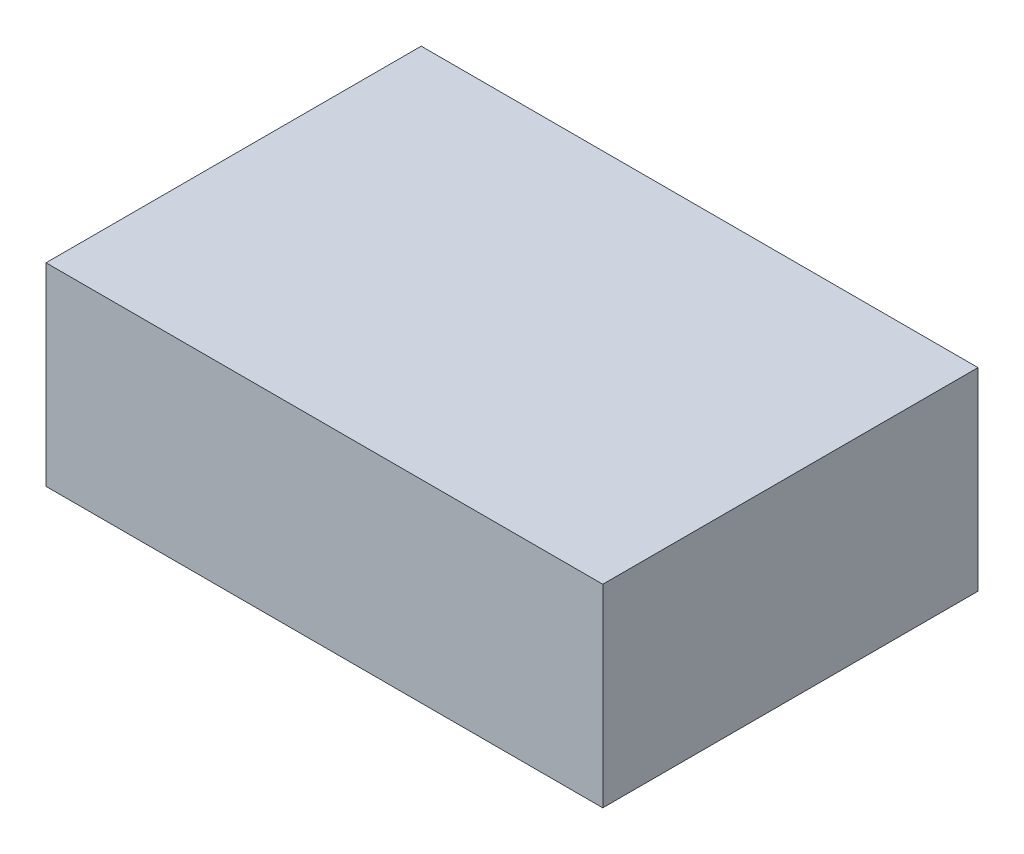
ISO-10303-21;
HEADER;
FILE_DESCRIPTION(('STEP AP214'),'2;1');
FILE_NAME('part.step','',(''),(''),'','','');
FILE_SCHEMA(('AUTOMOTIVE_DESIGN { 1 0 10303 214 1 1 1 1 }'));
ENDSEC;
DATA;
#1=APPLICATION_CONTEXT('core data for automotive mechanical design processes');
#2=APPLICATION_PROTOCOL_DEFINITION('international standard','automotive_design',2000,#1);
#3=PRODUCT_CONTEXT('',#1,'mechanical');
#4=PRODUCT('Part','Part','',(#3));
#5=PRODUCT_RELATED_PRODUCT_CATEGORY('part','',(#4));
#6=PRODUCT_DEFINITION_FORMATION('','',#4);
#7=PRODUCT_DEFINITION_CONTEXT('part definition',#1,'design');
#8=PRODUCT_DEFINITION('design','',#6,#7);
#9=PRODUCT_DEFINITION_SHAPE('','',#8);
#10=(LENGTH_UNIT() NAMED_UNIT(*) SI_UNIT(.MILLI.,.METRE.));
#11=(NAMED_UNIT(*) PLANE_ANGLE_UNIT() SI_UNIT($,.RADIAN.));
#12=(NAMED_UNIT(*) SI_UNIT($,.STERADIAN.) SOLID_ANGLE_UNIT());
#13=UNCERTAINTY_MEASURE_WITH_UNIT(LENGTH_MEASURE(1.E-05),#10,'distance_accuracy_value','');
#14=(GEOMETRIC_REPRESENTATION_CONTEXT(3) GLOBAL_UNCERTAINTY_ASSIGNED_CONTEXT((#13)) GLOBAL_UNIT_ASSIGNED_CONTEXT((#10,
#11,#12)) REPRESENTATION_CONTEXT('',''));
#15=CARTESIAN_POINT('',(0.,0.,0.));
#16=DIRECTION('',(0.,0.,1.));
#17=DIRECTION('',(1.,0.,0.));
#18=AXIS2_PLACEMENT_3D('',#15,#16,#17);
#19=CARTESIAN_POINT('',(23.,16.,-15.5));
#20=DIRECTION('',(-1.,0.,0.));
#21=DIRECTION('',(0.,0.,1.));
#22=AXIS2_PLACEMENT_3D('',#19,#20,#21);
#23=PLANE('',#22);
#24=DIRECTION('',(0.,0.,-1.));
#25=VECTOR('',#24,1.);
#26=CARTESIAN_POINT('',(23.,0.,-15.5));
#27=LINE('',#26,#25);
#28=CARTESIAN_POINT('',(23.,0.,15.5));
#29=VERTEX_POINT('',#28);
#30=CARTESIAN_POINT('',(23.,0.,-15.5));
#31=VERTEX_POINT('',#30);
#32=EDGE_CURVE('E96',#29,#31,#27,.T.);
#33=ORIENTED_EDGE('',*,*,#32,.T.);
#34=DIRECTION('',(0.,-1.,0.));
#35=VECTOR('',#34,1.);
#36=CARTESIAN_POINT('',(23.,16.,-15.5));
#37=LINE('',#36,#35);
#38=CARTESIAN_POINT('',(23.,16.,-15.5));
#39=VERTEX_POINT('',#38);
#40=EDGE_CURVE('E11',#39,#31,#37,.T.);
#41=ORIENTED_EDGE('',*,*,#40,.F.);
#42=DIRECTION('',(0.,0.,-1.));
#43=VECTOR('',#42,1.);
#44=CARTESIAN_POINT('',(23.,16.,-15.5));
#45=LINE('',#44,#43);
#46=CARTESIAN_POINT('',(23.,16.,15.5));
#47=VERTEX_POINT('',#46);
#48=EDGE_CURVE('E84',#47,#39,#45,.T.);
#49=ORIENTED_EDGE('',*,*,#48,.F.);
#50=DIRECTION('',(0.,-1.,0.));
#51=VECTOR('',#50,1.);
#52=CARTESIAN_POINT('',(23.,16.,15.5));
#53=LINE('',#52,#51);
#54=EDGE_CURVE('E92',#47,#29,#53,.T.);
#55=ORIENTED_EDGE('',*,*,#54,.T.);
#56=EDGE_LOOP('',(#33,#41,#49,#55));
#57=FACE_BOUND('',#56,.T.);
#58=ADVANCED_FACE('F33',(#57),#23,.F.);
#59=CARTESIAN_POINT('',(-23.,16.,-15.5));
#60=DIRECTION('',(0.,0.,1.));
#61=DIRECTION('',(1.,0.,0.));
#62=AXIS2_PLACEMENT_3D('',#59,#60,#61);
#63=PLANE('',#62);
#64=DIRECTION('',(-1.,0.,0.));
#65=VECTOR('',#64,1.);
#66=CARTESIAN_POINT('',(-23.,0.,-15.5));
#67=LINE('',#66,#65);
#68=CARTESIAN_POINT('',(-23.,0.,-15.5));
#69=VERTEX_POINT('',#68);
#70=EDGE_CURVE('E88',#31,#69,#67,.T.);
#71=ORIENTED_EDGE('',*,*,#70,.T.);
#72=DIRECTION('',(0.,-1.,0.));
#73=VECTOR('',#72,1.);
#74=CARTESIAN_POINT('',(-23.,16.,-15.5));
#75=LINE('',#74,#73);
#76=CARTESIAN_POINT('',(-23.,16.,-15.5));
#77=VERTEX_POINT('',#76);
#78=EDGE_CURVE('E41',#77,#69,#75,.T.);
#79=ORIENTED_EDGE('',*,*,#78,.F.);
#80=DIRECTION('',(-1.,0.,0.));
#81=VECTOR('',#80,1.);
#82=CARTESIAN_POINT('',(-23.,16.,-15.5));
#83=LINE('',#82,#81);
#84=EDGE_CURVE('E79',#39,#77,#83,.T.);
#85=ORIENTED_EDGE('',*,*,#84,.F.);
#86=ORIENTED_EDGE('',*,*,#40,.T.);
#87=EDGE_LOOP('',(#71,#79,#85,#86));
#88=FACE_BOUND('',#87,.T.);
#89=ADVANCED_FACE('F87',(#88),#63,.F.);
#90=CARTESIAN_POINT('',(-23.,16.,-15.5));
#91=DIRECTION('',(1.,0.,0.));
#92=DIRECTION('',(0.,0.,-1.));
#93=AXIS2_PLACEMENT_3D('',#90,#91,#92);
#94=PLANE('',#93);
#95=DIRECTION('',(0.,0.,1.));
#96=VECTOR('',#95,1.);
#97=CARTESIAN_POINT('',(-23.,0.,-15.5));
#98=LINE('',#97,#96);
#99=CARTESIAN_POINT('',(-23.,0.,15.5));
#100=VERTEX_POINT('',#99);
#101=EDGE_CURVE('E66',#69,#100,#98,.T.);
#102=ORIENTED_EDGE('',*,*,#101,.T.);
#103=DIRECTION('',(0.,-1.,0.));
#104=VECTOR('',#103,1.);
#105=CARTESIAN_POINT('',(-23.,16.,15.5));
#106=LINE('',#105,#104);
#107=CARTESIAN_POINT('',(-23.,16.,15.5));
#108=VERTEX_POINT('',#107);
#109=EDGE_CURVE('E89',#108,#100,#106,.T.);
#110=ORIENTED_EDGE('',*,*,#109,.F.);
#111=DIRECTION('',(0.,0.,1.));
#112=VECTOR('',#111,1.);
#113=CARTESIAN_POINT('',(-23.,16.,-15.5));
#114=LINE('',#113,#112);
#115=EDGE_CURVE('E82',#77,#108,#114,.T.);
#116=ORIENTED_EDGE('',*,*,#115,.F.);
#117=ORIENTED_EDGE('',*,*,#78,.T.);
#118=EDGE_LOOP('',(#102,#110,#116,#117));
#119=FACE_BOUND('',#118,.T.);
#120=ADVANCED_FACE('F90',(#119),#94,.F.);
#121=CARTESIAN_POINT('',(-23.,16.,15.5));
#122=DIRECTION('',(0.,0.,-1.));
#123=DIRECTION('',(-1.,0.,0.));
#124=AXIS2_PLACEMENT_3D('',#121,#122,#123);
#125=PLANE('',#124);
#126=DIRECTION('',(1.,0.,0.));
#127=VECTOR('',#126,1.);
#128=CARTESIAN_POINT('',(-23.,0.,15.5));
#129=LINE('',#128,#127);
#130=EDGE_CURVE('E72',#100,#29,#129,.T.);
#131=ORIENTED_EDGE('',*,*,#130,.T.);
#132=ORIENTED_EDGE('',*,*,#54,.F.);
#133=DIRECTION('',(1.,0.,0.));
#134=VECTOR('',#133,1.);
#135=CARTESIAN_POINT('',(-23.,16.,15.5));
#136=LINE('',#135,#134);
#137=EDGE_CURVE('E49',#108,#47,#136,.T.);
#138=ORIENTED_EDGE('',*,*,#137,.F.);
#139=ORIENTED_EDGE('',*,*,#109,.T.);
#140=EDGE_LOOP('',(#131,#132,#138,#139));
#141=FACE_BOUND('',#140,.T.);
#142=ADVANCED_FACE('F103',(#141),#125,.F.);
#143=CARTESIAN_POINT('',(0.,16.,0.));
#144=DIRECTION('',(0.,1.,0.));
#145=DIRECTION('',(0.,0.,1.));
#146=AXIS2_PLACEMENT_3D('',#143,#144,#145);
#147=PLANE('',#146);
#148=ORIENTED_EDGE('',*,*,#48,.T.);
#149=ORIENTED_EDGE('',*,*,#84,.T.);
#150=ORIENTED_EDGE('',*,*,#115,.T.);
#151=ORIENTED_EDGE('',*,*,#137,.T.);
#152=EDGE_LOOP('',(#148,#149,#150,#151));
#153=FACE_BOUND('',#152,.T.);
#154=ADVANCED_FACE('F80',(#153),#147,.T.);
#155=CARTESIAN_POINT('',(0.,0.,0.));
#156=DIRECTION('',(0.,1.,0.));
#157=DIRECTION('',(0.,0.,1.));
#158=AXIS2_PLACEMENT_3D('',#155,#156,#157);
#159=PLANE('',#158);
#160=ORIENTED_EDGE('',*,*,#32,.F.);
#161=ORIENTED_EDGE('',*,*,#130,.F.);
#162=ORIENTED_EDGE('',*,*,#101,.F.);
#163=ORIENTED_EDGE('',*,*,#70,.F.);
#164=EDGE_LOOP('',(#160,#161,#162,#163));
#165=FACE_BOUND('',#164,.T.);
#166=ADVANCED_FACE('F106',(#165),#159,.F.);
#167=CLOSED_SHELL('',(#58,#89,#120,#142,#154,#166));
#168=MANIFOLD_SOLID_BREP('B2',#167);
#169=ADVANCED_BREP_SHAPE_REPRESENTATION('',(#18,#168),#14);
#170=SHAPE_DEFINITION_REPRESENTATION(#9,#169);
ENDSEC;
END-ISO-10303-21;
